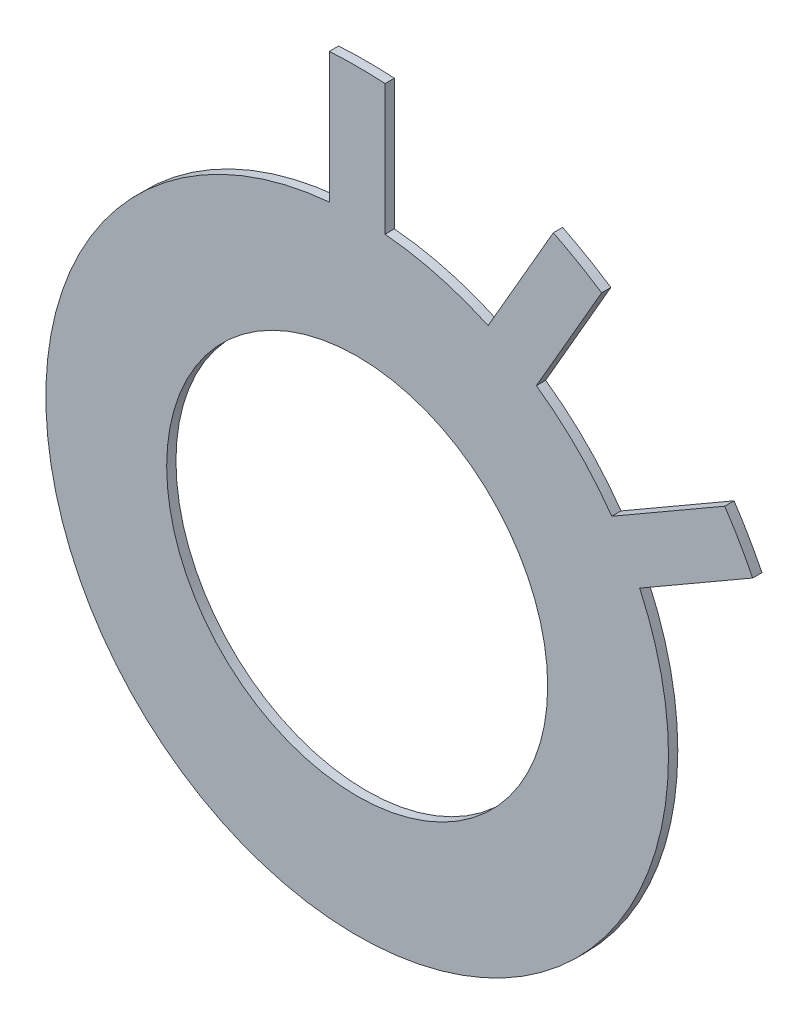
ISO-10303-21;
HEADER;
FILE_DESCRIPTION(('STEP AP214'),'2;1');
FILE_NAME('part.step','',(''),(''),'','','');
FILE_SCHEMA(('AUTOMOTIVE_DESIGN { 1 0 10303 214 1 1 1 1 }'));
ENDSEC;
DATA;
#1=APPLICATION_CONTEXT('core data for automotive mechanical design processes');
#2=APPLICATION_PROTOCOL_DEFINITION('international standard','automotive_design',2000,#1);
#3=PRODUCT_CONTEXT('',#1,'mechanical');
#4=PRODUCT('Part','Part','',(#3));
#5=PRODUCT_RELATED_PRODUCT_CATEGORY('part','',(#4));
#6=PRODUCT_DEFINITION_FORMATION('','',#4);
#7=PRODUCT_DEFINITION_CONTEXT('part definition',#1,'design');
#8=PRODUCT_DEFINITION('design','',#6,#7);
#9=PRODUCT_DEFINITION_SHAPE('','',#8);
#10=(LENGTH_UNIT() NAMED_UNIT(*) SI_UNIT(.MILLI.,.METRE.));
#11=(NAMED_UNIT(*) PLANE_ANGLE_UNIT() SI_UNIT($,.RADIAN.));
#12=(NAMED_UNIT(*) SI_UNIT($,.STERADIAN.) SOLID_ANGLE_UNIT());
#13=UNCERTAINTY_MEASURE_WITH_UNIT(LENGTH_MEASURE(1.E-05),#10,'distance_accuracy_value','');
#14=(GEOMETRIC_REPRESENTATION_CONTEXT(3) GLOBAL_UNCERTAINTY_ASSIGNED_CONTEXT((#13)) GLOBAL_UNIT_ASSIGNED_CONTEXT((#10,
#11,#12)) REPRESENTATION_CONTEXT('',''));
#15=CARTESIAN_POINT('',(0.,0.,0.));
#16=DIRECTION('',(0.,0.,1.));
#17=DIRECTION('',(1.,0.,0.));
#18=AXIS2_PLACEMENT_3D('',#15,#16,#17);
#19=CARTESIAN_POINT('',(0.,0.,1.));
#20=DIRECTION('',(0.,0.,1.));
#21=DIRECTION('',(1.,0.,0.));
#22=AXIS2_PLACEMENT_3D('',#19,#20,#21);
#23=PLANE('',#22);
#24=CARTESIAN_POINT('',(0.,0.,1.));
#25=DIRECTION('',(0.,0.,1.));
#26=DIRECTION('',(1.,0.,0.));
#27=AXIS2_PLACEMENT_3D('',#24,#25,#26);
#28=CIRCLE('',#27,47.5);
#29=CARTESIAN_POINT('',(3.,47.4051684945851,1.));
#30=VERTEX_POINT('',#29);
#31=CARTESIAN_POINT('',(-3.,47.4051684945851,1.));
#32=VERTEX_POINT('',#31);
#33=EDGE_CURVE('E178',#30,#32,#28,.T.);
#34=ORIENTED_EDGE('',*,*,#33,.T.);
#35=DIRECTION('',(0.,-1.,0.));
#36=VECTOR('',#35,1.);
#37=CARTESIAN_POINT('',(-3.,33.3654012414057,1.));
#38=LINE('',#37,#36);
#39=CARTESIAN_POINT('',(-3.,33.3654012414057,1.));
#40=VERTEX_POINT('',#39);
#41=EDGE_CURVE('E106',#32,#40,#38,.T.);
#42=ORIENTED_EDGE('',*,*,#41,.T.);
#43=CARTESIAN_POINT('',(0.,0.,1.));
#44=DIRECTION('',(0.,0.,1.));
#45=DIRECTION('',(1.,0.,0.));
#46=AXIS2_PLACEMENT_3D('',#43,#44,#45);
#47=CIRCLE('',#46,33.5);
#48=CARTESIAN_POINT('',(30.3952850825182,14.0846244093495,1.));
#49=VERTEX_POINT('',#48);
#50=EDGE_CURVE('E205',#40,#49,#47,.T.);
#51=ORIENTED_EDGE('',*,*,#50,.T.);
#52=DIRECTION('',(0.86602540378444,0.499999999999998,0.));
#53=VECTOR('',#52,1.);
#54=CARTESIAN_POINT('',(30.3952850825183,14.0846244093495,1.));
#55=LINE('',#54,#53);
#56=CARTESIAN_POINT('',(42.5540801869924,21.1045080359391,1.));
#57=VERTEX_POINT('',#56);
#58=EDGE_CURVE('E224',#49,#57,#55,.T.);
#59=ORIENTED_EDGE('',*,*,#58,.T.);
#60=CARTESIAN_POINT('',(0.,0.,1.));
#61=DIRECTION('',(0.,0.,1.));
#62=DIRECTION('',(1.,0.,0.));
#63=AXIS2_PLACEMENT_3D('',#60,#61,#62);
#64=CIRCLE('',#63,47.5);
#65=CARTESIAN_POINT('',(39.5540801869925,26.3006604586458,1.));
#66=VERTEX_POINT('',#65);
#67=EDGE_CURVE('E221',#57,#66,#64,.T.);
#68=ORIENTED_EDGE('',*,*,#67,.T.);
#69=DIRECTION('',(-0.86602540378444,-0.499999999999998,0.));
#70=VECTOR('',#69,1.);
#71=CARTESIAN_POINT('',(27.3952850825183,19.2807768320561,1.));
#72=LINE('',#71,#70);
#73=CARTESIAN_POINT('',(27.3952850825183,19.2807768320561,1.));
#74=VERTEX_POINT('',#73);
#75=EDGE_CURVE('E223',#66,#74,#72,.T.);
#76=ORIENTED_EDGE('',*,*,#75,.T.);
#77=CARTESIAN_POINT('',(0.,0.,1.));
#78=DIRECTION('',(0.,0.,1.));
#79=DIRECTION('',(1.,0.,0.));
#80=AXIS2_PLACEMENT_3D('',#77,#78,#79);
#81=CIRCLE('',#80,33.5);
#82=CARTESIAN_POINT('',(19.2807768320562,27.3952850825182,1.));
#83=VERTEX_POINT('',#82);
#84=EDGE_CURVE('E226',#74,#83,#81,.T.);
#85=ORIENTED_EDGE('',*,*,#84,.T.);
#86=DIRECTION('',(0.500000000000001,0.866025403784438,0.));
#87=VECTOR('',#86,1.);
#88=CARTESIAN_POINT('',(19.2807768320562,27.3952850825182,1.));
#89=LINE('',#88,#87);
#90=CARTESIAN_POINT('',(26.3006604586459,39.5540801869924,1.));
#91=VERTEX_POINT('',#90);
#92=EDGE_CURVE('E232',#83,#91,#89,.T.);
#93=ORIENTED_EDGE('',*,*,#92,.T.);
#94=CARTESIAN_POINT('',(0.,0.,1.));
#95=DIRECTION('',(0.,0.,1.));
#96=DIRECTION('',(1.,0.,0.));
#97=AXIS2_PLACEMENT_3D('',#94,#95,#96);
#98=CIRCLE('',#97,47.5);
#99=CARTESIAN_POINT('',(21.1045080359393,42.5540801869924,1.));
#100=VERTEX_POINT('',#99);
#101=EDGE_CURVE('E137',#91,#100,#98,.T.);
#102=ORIENTED_EDGE('',*,*,#101,.T.);
#103=DIRECTION('',(-0.500000000000001,-0.866025403784438,0.));
#104=VECTOR('',#103,1.);
#105=CARTESIAN_POINT('',(14.0846244093496,30.3952850825182,1.));
#106=LINE('',#105,#104);
#107=CARTESIAN_POINT('',(14.0846244093496,30.3952850825182,1.));
#108=VERTEX_POINT('',#107);
#109=EDGE_CURVE('E131',#100,#108,#106,.T.);
#110=ORIENTED_EDGE('',*,*,#109,.T.);
#111=CARTESIAN_POINT('',(0.,0.,1.));
#112=DIRECTION('',(0.,0.,1.));
#113=DIRECTION('',(1.,0.,0.));
#114=AXIS2_PLACEMENT_3D('',#111,#112,#113);
#115=CIRCLE('',#114,33.5);
#116=CARTESIAN_POINT('',(3.,33.3654012414057,1.));
#117=VERTEX_POINT('',#116);
#118=EDGE_CURVE('E135',#108,#117,#115,.T.);
#119=ORIENTED_EDGE('',*,*,#118,.T.);
#120=DIRECTION('',(0.,1.,0.));
#121=VECTOR('',#120,1.);
#122=CARTESIAN_POINT('',(3.,33.3654012414057,1.));
#123=LINE('',#122,#121);
#124=EDGE_CURVE('E51',#117,#30,#123,.T.);
#125=ORIENTED_EDGE('',*,*,#124,.T.);
#126=EDGE_LOOP('',(#34,#42,#51,#59,#68,#76,#85,#93,#102,#110,#119,#125));
#127=FACE_BOUND('',#126,.T.);
#128=CARTESIAN_POINT('',(0.,0.,1.));
#129=DIRECTION('',(0.,0.,1.));
#130=DIRECTION('',(1.,0.,0.));
#131=AXIS2_PLACEMENT_3D('',#128,#129,#130);
#132=CIRCLE('',#131,20.5);
#133=CARTESIAN_POINT('',(20.5,0.,1.));
#134=VERTEX_POINT('',#133);
#135=EDGE_CURVE('E159',#134,#134,#132,.T.);
#136=ORIENTED_EDGE('',*,*,#135,.F.);
#137=EDGE_LOOP('',(#136));
#138=FACE_BOUND('',#137,.T.);
#139=ADVANCED_FACE('F34',(#127,#138),#23,.T.);
#140=CARTESIAN_POINT('',(0.,0.,0.));
#141=DIRECTION('',(0.,0.,1.));
#142=DIRECTION('',(1.,0.,0.));
#143=AXIS2_PLACEMENT_3D('',#140,#141,#142);
#144=PLANE('',#143);
#145=CARTESIAN_POINT('',(0.,0.,0.));
#146=DIRECTION('',(0.,0.,1.));
#147=DIRECTION('',(1.,0.,0.));
#148=AXIS2_PLACEMENT_3D('',#145,#146,#147);
#149=CIRCLE('',#148,47.5);
#150=CARTESIAN_POINT('',(3.,47.4051684945851,0.));
#151=VERTEX_POINT('',#150);
#152=CARTESIAN_POINT('',(-3.,47.4051684945851,0.));
#153=VERTEX_POINT('',#152);
#154=EDGE_CURVE('E155',#151,#153,#149,.T.);
#155=ORIENTED_EDGE('',*,*,#154,.F.);
#156=DIRECTION('',(0.,1.,0.));
#157=VECTOR('',#156,1.);
#158=CARTESIAN_POINT('',(3.,33.3654012414057,0.));
#159=LINE('',#158,#157);
#160=CARTESIAN_POINT('',(3.,33.3654012414057,0.));
#161=VERTEX_POINT('',#160);
#162=EDGE_CURVE('E98',#161,#151,#159,.T.);
#163=ORIENTED_EDGE('',*,*,#162,.F.);
#164=CARTESIAN_POINT('',(0.,0.,0.));
#165=DIRECTION('',(0.,0.,1.));
#166=DIRECTION('',(1.,0.,0.));
#167=AXIS2_PLACEMENT_3D('',#164,#165,#166);
#168=CIRCLE('',#167,33.5);
#169=CARTESIAN_POINT('',(14.0846244093496,30.3952850825182,0.));
#170=VERTEX_POINT('',#169);
#171=EDGE_CURVE('E92',#170,#161,#168,.T.);
#172=ORIENTED_EDGE('',*,*,#171,.F.);
#173=DIRECTION('',(-0.500000000000001,-0.866025403784438,0.));
#174=VECTOR('',#173,1.);
#175=CARTESIAN_POINT('',(14.0846244093496,30.3952850825182,0.));
#176=LINE('',#175,#174);
#177=CARTESIAN_POINT('',(21.1045080359393,42.5540801869924,0.));
#178=VERTEX_POINT('',#177);
#179=EDGE_CURVE('E145',#178,#170,#176,.T.);
#180=ORIENTED_EDGE('',*,*,#179,.F.);
#181=CARTESIAN_POINT('',(0.,0.,0.));
#182=DIRECTION('',(0.,0.,1.));
#183=DIRECTION('',(1.,0.,0.));
#184=AXIS2_PLACEMENT_3D('',#181,#182,#183);
#185=CIRCLE('',#184,47.5);
#186=CARTESIAN_POINT('',(26.3006604586459,39.5540801869924,0.));
#187=VERTEX_POINT('',#186);
#188=EDGE_CURVE('E173',#187,#178,#185,.T.);
#189=ORIENTED_EDGE('',*,*,#188,.F.);
#190=DIRECTION('',(0.500000000000001,0.866025403784438,0.));
#191=VECTOR('',#190,1.);
#192=CARTESIAN_POINT('',(19.2807768320562,27.3952850825182,0.));
#193=LINE('',#192,#191);
#194=CARTESIAN_POINT('',(19.2807768320562,27.3952850825182,0.));
#195=VERTEX_POINT('',#194);
#196=EDGE_CURVE('E171',#195,#187,#193,.T.);
#197=ORIENTED_EDGE('',*,*,#196,.F.);
#198=CARTESIAN_POINT('',(0.,0.,0.));
#199=DIRECTION('',(0.,0.,1.));
#200=DIRECTION('',(1.,0.,0.));
#201=AXIS2_PLACEMENT_3D('',#198,#199,#200);
#202=CIRCLE('',#201,33.5);
#203=CARTESIAN_POINT('',(27.3952850825183,19.2807768320561,0.));
#204=VERTEX_POINT('',#203);
#205=EDGE_CURVE('E169',#204,#195,#202,.T.);
#206=ORIENTED_EDGE('',*,*,#205,.F.);
#207=DIRECTION('',(-0.86602540378444,-0.499999999999998,0.));
#208=VECTOR('',#207,1.);
#209=CARTESIAN_POINT('',(27.3952850825183,19.2807768320561,0.));
#210=LINE('',#209,#208);
#211=CARTESIAN_POINT('',(39.5540801869925,26.3006604586458,0.));
#212=VERTEX_POINT('',#211);
#213=EDGE_CURVE('E167',#212,#204,#210,.T.);
#214=ORIENTED_EDGE('',*,*,#213,.F.);
#215=CARTESIAN_POINT('',(0.,0.,0.));
#216=DIRECTION('',(0.,0.,1.));
#217=DIRECTION('',(1.,0.,0.));
#218=AXIS2_PLACEMENT_3D('',#215,#216,#217);
#219=CIRCLE('',#218,47.5);
#220=CARTESIAN_POINT('',(42.5540801869924,21.1045080359391,0.));
#221=VERTEX_POINT('',#220);
#222=EDGE_CURVE('E165',#221,#212,#219,.T.);
#223=ORIENTED_EDGE('',*,*,#222,.F.);
#224=DIRECTION('',(0.86602540378444,0.499999999999998,0.));
#225=VECTOR('',#224,1.);
#226=CARTESIAN_POINT('',(30.3952850825183,14.0846244093495,0.));
#227=LINE('',#226,#225);
#228=CARTESIAN_POINT('',(30.3952850825182,14.0846244093495,0.));
#229=VERTEX_POINT('',#228);
#230=EDGE_CURVE('E163',#229,#221,#227,.T.);
#231=ORIENTED_EDGE('',*,*,#230,.F.);
#232=CARTESIAN_POINT('',(0.,0.,0.));
#233=DIRECTION('',(0.,0.,1.));
#234=DIRECTION('',(1.,0.,0.));
#235=AXIS2_PLACEMENT_3D('',#232,#233,#234);
#236=CIRCLE('',#235,33.5);
#237=CARTESIAN_POINT('',(-3.,33.3654012414057,0.));
#238=VERTEX_POINT('',#237);
#239=EDGE_CURVE('E161',#238,#229,#236,.T.);
#240=ORIENTED_EDGE('',*,*,#239,.F.);
#241=DIRECTION('',(0.,-1.,0.));
#242=VECTOR('',#241,1.);
#243=CARTESIAN_POINT('',(-3.,33.3654012414057,0.));
#244=LINE('',#243,#242);
#245=EDGE_CURVE('E158',#153,#238,#244,.T.);
#246=ORIENTED_EDGE('',*,*,#245,.F.);
#247=EDGE_LOOP('',(#155,#163,#172,#180,#189,#197,#206,#214,#223,#231,#240,#246));
#248=FACE_BOUND('',#247,.T.);
#249=CARTESIAN_POINT('',(0.,0.,0.));
#250=DIRECTION('',(0.,0.,1.));
#251=DIRECTION('',(1.,0.,0.));
#252=AXIS2_PLACEMENT_3D('',#249,#250,#251);
#253=CIRCLE('',#252,20.5);
#254=CARTESIAN_POINT('',(20.5,0.,0.));
#255=VERTEX_POINT('',#254);
#256=EDGE_CURVE('E381',#255,#255,#253,.T.);
#257=ORIENTED_EDGE('',*,*,#256,.T.);
#258=EDGE_LOOP('',(#257));
#259=FACE_BOUND('',#258,.T.);
#260=ADVANCED_FACE('F209',(#248,#259),#144,.F.);
#261=CARTESIAN_POINT('',(0.,0.,1.));
#262=DIRECTION('',(0.,0.,-1.));
#263=DIRECTION('',(-1.,0.,0.));
#264=AXIS2_PLACEMENT_3D('',#261,#262,#263);
#265=CYLINDRICAL_SURFACE('',#264,47.5);
#266=ORIENTED_EDGE('',*,*,#154,.T.);
#267=DIRECTION('',(0.,0.,-1.));
#268=VECTOR('',#267,1.);
#269=CARTESIAN_POINT('',(-3.,47.4051684945851,1.));
#270=LINE('',#269,#268);
#271=EDGE_CURVE('E11',#32,#153,#270,.T.);
#272=ORIENTED_EDGE('',*,*,#271,.F.);
#273=ORIENTED_EDGE('',*,*,#33,.F.);
#274=DIRECTION('',(0.,0.,-1.));
#275=VECTOR('',#274,1.);
#276=CARTESIAN_POINT('',(3.,47.4051684945851,1.));
#277=LINE('',#276,#275);
#278=EDGE_CURVE('E151',#30,#151,#277,.T.);
#279=ORIENTED_EDGE('',*,*,#278,.T.);
#280=EDGE_LOOP('',(#266,#272,#273,#279));
#281=FACE_BOUND('',#280,.T.);
#282=ADVANCED_FACE('F36',(#281),#265,.T.);
#283=CARTESIAN_POINT('',(-3.,33.3654012414057,1.));
#284=DIRECTION('',(1.,0.,0.));
#285=DIRECTION('',(0.,1.,0.));
#286=AXIS2_PLACEMENT_3D('',#283,#284,#285);
#287=PLANE('',#286);
#288=ORIENTED_EDGE('',*,*,#245,.T.);
#289=DIRECTION('',(0.,0.,-1.));
#290=VECTOR('',#289,1.);
#291=CARTESIAN_POINT('',(-3.,33.3654012414057,1.));
#292=LINE('',#291,#290);
#293=EDGE_CURVE('E43',#40,#238,#292,.T.);
#294=ORIENTED_EDGE('',*,*,#293,.F.);
#295=ORIENTED_EDGE('',*,*,#41,.F.);
#296=ORIENTED_EDGE('',*,*,#271,.T.);
#297=EDGE_LOOP('',(#288,#294,#295,#296));
#298=FACE_BOUND('',#297,.T.);
#299=ADVANCED_FACE('F266',(#298),#287,.F.);
#300=CARTESIAN_POINT('',(0.,0.,1.));
#301=DIRECTION('',(0.,0.,-1.));
#302=DIRECTION('',(-1.,0.,0.));
#303=AXIS2_PLACEMENT_3D('',#300,#301,#302);
#304=CYLINDRICAL_SURFACE('',#303,33.5);
#305=ORIENTED_EDGE('',*,*,#239,.T.);
#306=DIRECTION('',(0.,0.,-1.));
#307=VECTOR('',#306,1.);
#308=CARTESIAN_POINT('',(30.3952850825182,14.0846244093495,1.));
#309=LINE('',#308,#307);
#310=EDGE_CURVE('E197',#49,#229,#309,.T.);
#311=ORIENTED_EDGE('',*,*,#310,.F.);
#312=ORIENTED_EDGE('',*,*,#50,.F.);
#313=ORIENTED_EDGE('',*,*,#293,.T.);
#314=EDGE_LOOP('',(#305,#311,#312,#313));
#315=FACE_BOUND('',#314,.T.);
#316=ADVANCED_FACE('F203',(#315),#304,.T.);
#317=CARTESIAN_POINT('',(30.3952850825183,14.0846244093495,1.));
#318=DIRECTION('',(-0.499999999999998,0.86602540378444,0.));
#319=DIRECTION('',(-0.86602540378444,-0.499999999999998,0.));
#320=AXIS2_PLACEMENT_3D('',#317,#318,#319);
#321=PLANE('',#320);
#322=ORIENTED_EDGE('',*,*,#230,.T.);
#323=DIRECTION('',(0.,0.,-1.));
#324=VECTOR('',#323,1.);
#325=CARTESIAN_POINT('',(42.5540801869924,21.1045080359391,1.));
#326=LINE('',#325,#324);
#327=EDGE_CURVE('E194',#57,#221,#326,.T.);
#328=ORIENTED_EDGE('',*,*,#327,.F.);
#329=ORIENTED_EDGE('',*,*,#58,.F.);
#330=ORIENTED_EDGE('',*,*,#310,.T.);
#331=EDGE_LOOP('',(#322,#328,#329,#330));
#332=FACE_BOUND('',#331,.T.);
#333=ADVANCED_FACE('F215',(#332),#321,.F.);
#334=CARTESIAN_POINT('',(0.,0.,1.));
#335=DIRECTION('',(0.,0.,-1.));
#336=DIRECTION('',(-1.,0.,0.));
#337=AXIS2_PLACEMENT_3D('',#334,#335,#336);
#338=CYLINDRICAL_SURFACE('',#337,47.5);
#339=ORIENTED_EDGE('',*,*,#222,.T.);
#340=DIRECTION('',(0.,0.,-1.));
#341=VECTOR('',#340,1.);
#342=CARTESIAN_POINT('',(39.5540801869925,26.3006604586458,1.));
#343=LINE('',#342,#341);
#344=EDGE_CURVE('E191',#66,#212,#343,.T.);
#345=ORIENTED_EDGE('',*,*,#344,.F.);
#346=ORIENTED_EDGE('',*,*,#67,.F.);
#347=ORIENTED_EDGE('',*,*,#327,.T.);
#348=EDGE_LOOP('',(#339,#345,#346,#347));
#349=FACE_BOUND('',#348,.T.);
#350=ADVANCED_FACE('F219',(#349),#338,.T.);
#351=CARTESIAN_POINT('',(27.3952850825183,19.2807768320561,1.));
#352=DIRECTION('',(0.499999999999998,-0.86602540378444,0.));
#353=DIRECTION('',(0.86602540378444,0.499999999999998,0.));
#354=AXIS2_PLACEMENT_3D('',#351,#352,#353);
#355=PLANE('',#354);
#356=ORIENTED_EDGE('',*,*,#213,.T.);
#357=DIRECTION('',(0.,0.,-1.));
#358=VECTOR('',#357,1.);
#359=CARTESIAN_POINT('',(27.3952850825183,19.2807768320561,1.));
#360=LINE('',#359,#358);
#361=EDGE_CURVE('E188',#74,#204,#360,.T.);
#362=ORIENTED_EDGE('',*,*,#361,.F.);
#363=ORIENTED_EDGE('',*,*,#75,.F.);
#364=ORIENTED_EDGE('',*,*,#344,.T.);
#365=EDGE_LOOP('',(#356,#362,#363,#364));
#366=FACE_BOUND('',#365,.T.);
#367=ADVANCED_FACE('F279',(#366),#355,.F.);
#368=CARTESIAN_POINT('',(0.,0.,1.));
#369=DIRECTION('',(0.,0.,-1.));
#370=DIRECTION('',(-1.,0.,0.));
#371=AXIS2_PLACEMENT_3D('',#368,#369,#370);
#372=CYLINDRICAL_SURFACE('',#371,33.5);
#373=ORIENTED_EDGE('',*,*,#205,.T.);
#374=DIRECTION('',(0.,0.,-1.));
#375=VECTOR('',#374,1.);
#376=CARTESIAN_POINT('',(19.2807768320562,27.3952850825182,1.));
#377=LINE('',#376,#375);
#378=EDGE_CURVE('E185',#83,#195,#377,.T.);
#379=ORIENTED_EDGE('',*,*,#378,.F.);
#380=ORIENTED_EDGE('',*,*,#84,.F.);
#381=ORIENTED_EDGE('',*,*,#361,.T.);
#382=EDGE_LOOP('',(#373,#379,#380,#381));
#383=FACE_BOUND('',#382,.T.);
#384=ADVANCED_FACE('F282',(#383),#372,.T.);
#385=CARTESIAN_POINT('',(19.2807768320562,27.3952850825182,1.));
#386=DIRECTION('',(-0.866025403784438,0.500000000000001,0.));
#387=DIRECTION('',(-0.500000000000001,-0.866025403784438,0.));
#388=AXIS2_PLACEMENT_3D('',#385,#386,#387);
#389=PLANE('',#388);
#390=ORIENTED_EDGE('',*,*,#196,.T.);
#391=DIRECTION('',(0.,0.,-1.));
#392=VECTOR('',#391,1.);
#393=CARTESIAN_POINT('',(26.3006604586459,39.5540801869924,1.));
#394=LINE('',#393,#392);
#395=EDGE_CURVE('E182',#91,#187,#394,.T.);
#396=ORIENTED_EDGE('',*,*,#395,.F.);
#397=ORIENTED_EDGE('',*,*,#92,.F.);
#398=ORIENTED_EDGE('',*,*,#378,.T.);
#399=EDGE_LOOP('',(#390,#396,#397,#398));
#400=FACE_BOUND('',#399,.T.);
#401=ADVANCED_FACE('F238',(#400),#389,.F.);
#402=CARTESIAN_POINT('',(0.,0.,1.));
#403=DIRECTION('',(0.,0.,-1.));
#404=DIRECTION('',(-1.,0.,0.));
#405=AXIS2_PLACEMENT_3D('',#402,#403,#404);
#406=CYLINDRICAL_SURFACE('',#405,47.5);
#407=ORIENTED_EDGE('',*,*,#188,.T.);
#408=DIRECTION('',(0.,0.,-1.));
#409=VECTOR('',#408,1.);
#410=CARTESIAN_POINT('',(21.1045080359393,42.5540801869924,1.));
#411=LINE('',#410,#409);
#412=EDGE_CURVE('E146',#100,#178,#411,.T.);
#413=ORIENTED_EDGE('',*,*,#412,.F.);
#414=ORIENTED_EDGE('',*,*,#101,.F.);
#415=ORIENTED_EDGE('',*,*,#395,.T.);
#416=EDGE_LOOP('',(#407,#413,#414,#415));
#417=FACE_BOUND('',#416,.T.);
#418=ADVANCED_FACE('F242',(#417),#406,.T.);
#419=CARTESIAN_POINT('',(14.0846244093496,30.3952850825182,1.));
#420=DIRECTION('',(0.866025403784438,-0.500000000000001,0.));
#421=DIRECTION('',(0.500000000000001,0.866025403784438,0.));
#422=AXIS2_PLACEMENT_3D('',#419,#420,#421);
#423=PLANE('',#422);
#424=ORIENTED_EDGE('',*,*,#179,.T.);
#425=DIRECTION('',(0.,0.,-1.));
#426=VECTOR('',#425,1.);
#427=CARTESIAN_POINT('',(14.0846244093496,30.3952850825182,1.));
#428=LINE('',#427,#426);
#429=EDGE_CURVE('E142',#108,#170,#428,.T.);
#430=ORIENTED_EDGE('',*,*,#429,.F.);
#431=ORIENTED_EDGE('',*,*,#109,.F.);
#432=ORIENTED_EDGE('',*,*,#412,.T.);
#433=EDGE_LOOP('',(#424,#430,#431,#432));
#434=FACE_BOUND('',#433,.T.);
#435=ADVANCED_FACE('F143',(#434),#423,.F.);
#436=CARTESIAN_POINT('',(0.,0.,1.));
#437=DIRECTION('',(0.,0.,-1.));
#438=DIRECTION('',(-1.,0.,0.));
#439=AXIS2_PLACEMENT_3D('',#436,#437,#438);
#440=CYLINDRICAL_SURFACE('',#439,33.5);
#441=ORIENTED_EDGE('',*,*,#171,.T.);
#442=DIRECTION('',(0.,0.,-1.));
#443=VECTOR('',#442,1.);
#444=CARTESIAN_POINT('',(3.,33.3654012414057,1.));
#445=LINE('',#444,#443);
#446=EDGE_CURVE('E147',#117,#161,#445,.T.);
#447=ORIENTED_EDGE('',*,*,#446,.F.);
#448=ORIENTED_EDGE('',*,*,#118,.F.);
#449=ORIENTED_EDGE('',*,*,#429,.T.);
#450=EDGE_LOOP('',(#441,#447,#448,#449));
#451=FACE_BOUND('',#450,.T.);
#452=ADVANCED_FACE('F149',(#451),#440,.T.);
#453=CARTESIAN_POINT('',(3.,33.3654012414057,1.));
#454=DIRECTION('',(-1.,0.,0.));
#455=DIRECTION('',(0.,-1.,0.));
#456=AXIS2_PLACEMENT_3D('',#453,#454,#455);
#457=PLANE('',#456);
#458=ORIENTED_EDGE('',*,*,#162,.T.);
#459=ORIENTED_EDGE('',*,*,#278,.F.);
#460=ORIENTED_EDGE('',*,*,#124,.F.);
#461=ORIENTED_EDGE('',*,*,#446,.T.);
#462=EDGE_LOOP('',(#458,#459,#460,#461));
#463=FACE_BOUND('',#462,.T.);
#464=ADVANCED_FACE('F246',(#463),#457,.F.);
#465=CARTESIAN_POINT('',(0.,0.,1.));
#466=DIRECTION('',(0.,0.,-1.));
#467=DIRECTION('',(-1.,0.,0.));
#468=AXIS2_PLACEMENT_3D('',#465,#466,#467);
#469=CYLINDRICAL_SURFACE('',#468,20.5);
#470=ORIENTED_EDGE('',*,*,#135,.T.);
#471=EDGE_LOOP('',(#470));
#472=FACE_BOUND('',#471,.T.);
#473=ORIENTED_EDGE('',*,*,#256,.F.);
#474=EDGE_LOOP('',(#473));
#475=FACE_BOUND('',#474,.T.);
#476=ADVANCED_FACE('F248',(#472,#475),#469,.F.);
#477=CLOSED_SHELL('',(#139,#260,#282,#299,#316,#333,#350,#367,#384,#401,#418,#435,#452,#464,#476));
#478=MANIFOLD_SOLID_BREP('B2',#477);
#479=ADVANCED_BREP_SHAPE_REPRESENTATION('',(#18,#478),#14);
#480=SHAPE_DEFINITION_REPRESENTATION(#9,#479);
ENDSEC;
END-ISO-10303-21;
